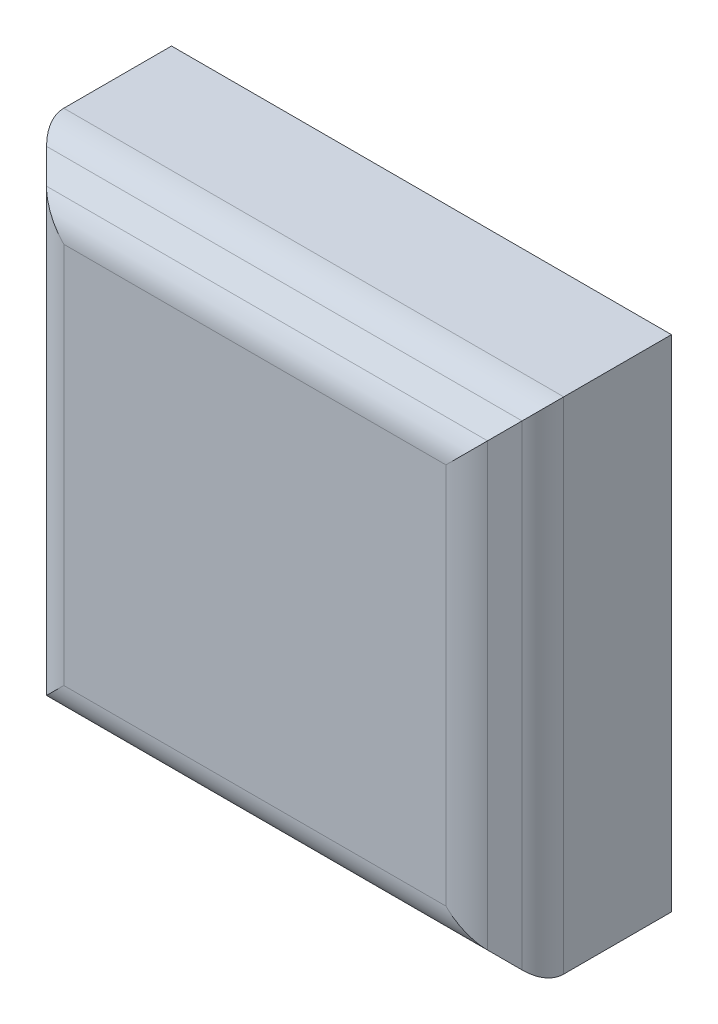
ISO-10303-21;
HEADER;
FILE_DESCRIPTION(('STEP AP214'),'2;1');
FILE_NAME('part.step','',(''),(''),'','','');
FILE_SCHEMA(('AUTOMOTIVE_DESIGN { 1 0 10303 214 1 1 1 1 }'));
ENDSEC;
DATA;
#1=APPLICATION_CONTEXT('core data for automotive mechanical design processes');
#2=APPLICATION_PROTOCOL_DEFINITION('international standard','automotive_design',2000,#1);
#3=PRODUCT_CONTEXT('',#1,'mechanical');
#4=PRODUCT('Part','Part','',(#3));
#5=PRODUCT_RELATED_PRODUCT_CATEGORY('part','',(#4));
#6=PRODUCT_DEFINITION_FORMATION('','',#4);
#7=PRODUCT_DEFINITION_CONTEXT('part definition',#1,'design');
#8=PRODUCT_DEFINITION('design','',#6,#7);
#9=PRODUCT_DEFINITION_SHAPE('','',#8);
#10=(LENGTH_UNIT() NAMED_UNIT(*) SI_UNIT(.MILLI.,.METRE.));
#11=(NAMED_UNIT(*) PLANE_ANGLE_UNIT() SI_UNIT($,.RADIAN.));
#12=(NAMED_UNIT(*) SI_UNIT($,.STERADIAN.) SOLID_ANGLE_UNIT());
#13=UNCERTAINTY_MEASURE_WITH_UNIT(LENGTH_MEASURE(1.E-05),#10,'distance_accuracy_value','');
#14=(GEOMETRIC_REPRESENTATION_CONTEXT(3) GLOBAL_UNCERTAINTY_ASSIGNED_CONTEXT((#13)) GLOBAL_UNIT_ASSIGNED_CONTEXT((#10,
#11,#12)) REPRESENTATION_CONTEXT('',''));
#15=CARTESIAN_POINT('',(0.,0.,0.));
#16=DIRECTION('',(0.,0.,1.));
#17=DIRECTION('',(1.,0.,0.));
#18=AXIS2_PLACEMENT_3D('',#15,#16,#17);
#19=CARTESIAN_POINT('',(-36.4889051706092,115.943688507431,40.));
#20=DIRECTION('',(1.,0.,0.));
#21=DIRECTION('',(0.,1.,0.));
#22=AXIS2_PLACEMENT_3D('',#19,#20,#21);
#23=PLANE('',#22);
#24=DIRECTION('',(0.,0.,-1.));
#25=VECTOR('',#24,1.);
#26=CARTESIAN_POINT('',(-36.4889051706092,-4.05631149256856,40.));
#27=LINE('',#26,#25);
#28=CARTESIAN_POINT('',(-36.4889051706092,-4.05631149256856,25.857864376269));
#29=VERTEX_POINT('',#28);
#30=CARTESIAN_POINT('',(-36.4889051706092,-4.05631149256856,0.));
#31=VERTEX_POINT('',#30);
#32=EDGE_CURVE('E219',#29,#31,#27,.T.);
#33=ORIENTED_EDGE('',*,*,#32,.F.);
#34=DIRECTION('',(0.,1.,0.));
#35=VECTOR('',#34,1.);
#36=CARTESIAN_POINT('',(-36.4889051706092,115.943688507431,25.857864376269));
#37=LINE('',#36,#35);
#38=CARTESIAN_POINT('',(-36.4889051706092,115.943688507431,25.857864376269));
#39=VERTEX_POINT('',#38);
#40=EDGE_CURVE('E60',#29,#39,#37,.T.);
#41=ORIENTED_EDGE('',*,*,#40,.T.);
#42=DIRECTION('',(0.,0.,-1.));
#43=VECTOR('',#42,1.);
#44=CARTESIAN_POINT('',(-36.4889051706092,115.943688507431,40.));
#45=LINE('',#44,#43);
#46=CARTESIAN_POINT('',(-36.4889051706092,115.943688507431,0.));
#47=VERTEX_POINT('',#46);
#48=EDGE_CURVE('E213',#39,#47,#45,.T.);
#49=ORIENTED_EDGE('',*,*,#48,.T.);
#50=DIRECTION('',(0.,-1.,0.));
#51=VECTOR('',#50,1.);
#52=CARTESIAN_POINT('',(-36.4889051706092,115.943688507431,0.));
#53=LINE('',#52,#51);
#54=EDGE_CURVE('E200',#47,#31,#53,.T.);
#55=ORIENTED_EDGE('',*,*,#54,.T.);
#56=EDGE_LOOP('',(#33,#41,#49,#55));
#57=FACE_BOUND('',#56,.T.);
#58=ADVANCED_FACE('F35',(#57),#23,.F.);
#59=CARTESIAN_POINT('',(-36.4889051706092,-4.05631149256856,40.));
#60=DIRECTION('',(0.,1.,0.));
#61=DIRECTION('',(0.,0.,1.));
#62=AXIS2_PLACEMENT_3D('',#59,#60,#61);
#63=PLANE('',#62);
#64=DIRECTION('',(0.,0.,-1.));
#65=VECTOR('',#64,1.);
#66=CARTESIAN_POINT('',(83.5110948293908,-4.05631149256856,40.));
#67=LINE('',#66,#65);
#68=CARTESIAN_POINT('',(83.5110948293908,-4.05631149256856,25.857864376269));
#69=VERTEX_POINT('',#68);
#70=CARTESIAN_POINT('',(83.5110948293908,-4.05631149256856,0.));
#71=VERTEX_POINT('',#70);
#72=EDGE_CURVE('E217',#69,#71,#67,.T.);
#73=ORIENTED_EDGE('',*,*,#72,.F.);
#74=DIRECTION('',(-1.,0.,0.));
#75=VECTOR('',#74,1.);
#76=CARTESIAN_POINT('',(-36.4889051706092,-4.05631149256856,25.857864376269));
#77=LINE('',#76,#75);
#78=EDGE_CURVE('E259',#69,#29,#77,.T.);
#79=ORIENTED_EDGE('',*,*,#78,.T.);
#80=ORIENTED_EDGE('',*,*,#32,.T.);
#81=DIRECTION('',(1.,0.,0.));
#82=VECTOR('',#81,1.);
#83=CARTESIAN_POINT('',(-36.4889051706092,-4.05631149256856,0.));
#84=LINE('',#83,#82);
#85=EDGE_CURVE('E203',#31,#71,#84,.T.);
#86=ORIENTED_EDGE('',*,*,#85,.T.);
#87=EDGE_LOOP('',(#73,#79,#80,#86));
#88=FACE_BOUND('',#87,.T.);
#89=ADVANCED_FACE('F339',(#88),#63,.F.);
#90=CARTESIAN_POINT('',(83.5110948293908,115.943688507431,40.));
#91=DIRECTION('',(-1.,0.,0.));
#92=DIRECTION('',(0.,-1.,0.));
#93=AXIS2_PLACEMENT_3D('',#90,#91,#92);
#94=PLANE('',#93);
#95=DIRECTION('',(0.,0.,-1.));
#96=VECTOR('',#95,1.);
#97=CARTESIAN_POINT('',(83.5110948293908,115.943688507431,40.));
#98=LINE('',#97,#96);
#99=CARTESIAN_POINT('',(83.5110948293908,115.943688507431,25.857864376269));
#100=VERTEX_POINT('',#99);
#101=CARTESIAN_POINT('',(83.5110948293908,115.943688507431,0.));
#102=VERTEX_POINT('',#101);
#103=EDGE_CURVE('E215',#100,#102,#98,.T.);
#104=ORIENTED_EDGE('',*,*,#103,.F.);
#105=DIRECTION('',(0.,-1.,0.));
#106=VECTOR('',#105,1.);
#107=CARTESIAN_POINT('',(83.5110948293908,-4.05631149256856,25.857864376269));
#108=LINE('',#107,#106);
#109=EDGE_CURVE('E221',#100,#69,#108,.T.);
#110=ORIENTED_EDGE('',*,*,#109,.T.);
#111=ORIENTED_EDGE('',*,*,#72,.T.);
#112=DIRECTION('',(0.,1.,0.));
#113=VECTOR('',#112,1.);
#114=CARTESIAN_POINT('',(83.5110948293908,115.943688507431,0.));
#115=LINE('',#114,#113);
#116=EDGE_CURVE('E207',#71,#102,#115,.T.);
#117=ORIENTED_EDGE('',*,*,#116,.T.);
#118=EDGE_LOOP('',(#104,#110,#111,#117));
#119=FACE_BOUND('',#118,.T.);
#120=ADVANCED_FACE('F330',(#119),#94,.F.);
#121=CARTESIAN_POINT('',(-36.4889051706092,115.943688507431,40.));
#122=DIRECTION('',(0.,-1.,0.));
#123=DIRECTION('',(0.,0.,-1.));
#124=AXIS2_PLACEMENT_3D('',#121,#122,#123);
#125=PLANE('',#124);
#126=ORIENTED_EDGE('',*,*,#48,.F.);
#127=DIRECTION('',(1.,0.,0.));
#128=VECTOR('',#127,1.);
#129=CARTESIAN_POINT('',(83.5110948293908,115.943688507431,25.857864376269));
#130=LINE('',#129,#128);
#131=EDGE_CURVE('E262',#39,#100,#130,.T.);
#132=ORIENTED_EDGE('',*,*,#131,.T.);
#133=ORIENTED_EDGE('',*,*,#103,.T.);
#134=DIRECTION('',(-1.,0.,0.));
#135=VECTOR('',#134,1.);
#136=CARTESIAN_POINT('',(-36.4889051706092,115.943688507431,0.));
#137=LINE('',#136,#135);
#138=EDGE_CURVE('E210',#102,#47,#137,.T.);
#139=ORIENTED_EDGE('',*,*,#138,.T.);
#140=EDGE_LOOP('',(#126,#132,#133,#139));
#141=FACE_BOUND('',#140,.T.);
#142=ADVANCED_FACE('F328',(#141),#125,.F.);
#143=CARTESIAN_POINT('',(0.,0.,40.));
#144=DIRECTION('',(0.,0.,1.));
#145=DIRECTION('',(1.,0.,0.));
#146=AXIS2_PLACEMENT_3D('',#143,#144,#145);
#147=PLANE('',#146);
#148=DIRECTION('',(0.,-1.,0.));
#149=VECTOR('',#148,1.);
#150=CARTESIAN_POINT('',(-22.3467695468782,0.,40.));
#151=LINE('',#150,#149);
#152=CARTESIAN_POINT('',(-22.3467695468782,101.8015528837,40.));
#153=VERTEX_POINT('',#152);
#154=CARTESIAN_POINT('',(-22.3467695468782,10.0858241311624,40.));
#155=VERTEX_POINT('',#154);
#156=EDGE_CURVE('E245',#153,#155,#151,.T.);
#157=ORIENTED_EDGE('',*,*,#156,.T.);
#158=DIRECTION('',(1.,0.,0.));
#159=VECTOR('',#158,1.);
#160=CARTESIAN_POINT('',(0.,10.0858241311624,40.));
#161=LINE('',#160,#159);
#162=CARTESIAN_POINT('',(69.3689592056599,10.0858241311624,40.));
#163=VERTEX_POINT('',#162);
#164=EDGE_CURVE('E248',#155,#163,#161,.T.);
#165=ORIENTED_EDGE('',*,*,#164,.T.);
#166=DIRECTION('',(0.,1.,0.));
#167=VECTOR('',#166,1.);
#168=CARTESIAN_POINT('',(69.3689592056599,0.,40.));
#169=LINE('',#168,#167);
#170=CARTESIAN_POINT('',(69.3689592056599,101.8015528837,40.));
#171=VERTEX_POINT('',#170);
#172=EDGE_CURVE('E243',#163,#171,#169,.T.);
#173=ORIENTED_EDGE('',*,*,#172,.T.);
#174=DIRECTION('',(-1.,0.,0.));
#175=VECTOR('',#174,1.);
#176=CARTESIAN_POINT('',(0.,101.8015528837,40.));
#177=LINE('',#176,#175);
#178=EDGE_CURVE('E241',#171,#153,#177,.T.);
#179=ORIENTED_EDGE('',*,*,#178,.T.);
#180=EDGE_LOOP('',(#157,#165,#173,#179));
#181=FACE_BOUND('',#180,.T.);
#182=ADVANCED_FACE('F417',(#181),#147,.T.);
#183=CARTESIAN_POINT('',(0.,0.,0.));
#184=DIRECTION('',(0.,0.,1.));
#185=DIRECTION('',(1.,0.,0.));
#186=AXIS2_PLACEMENT_3D('',#183,#184,#185);
#187=PLANE('',#186);
#188=DIRECTION('',(-1.,0.,0.));
#189=VECTOR('',#188,1.);
#190=CARTESIAN_POINT('',(-36.4889051706092,105.943688507431,0.));
#191=LINE('',#190,#189);
#192=CARTESIAN_POINT('',(73.5110948293908,105.943688507431,0.));
#193=VERTEX_POINT('',#192);
#194=CARTESIAN_POINT('',(-26.4889051706092,105.943688507431,0.));
#195=VERTEX_POINT('',#194);
#196=EDGE_CURVE('E195',#193,#195,#191,.T.);
#197=ORIENTED_EDGE('',*,*,#196,.T.);
#198=DIRECTION('',(0.,-1.,0.));
#199=VECTOR('',#198,1.);
#200=CARTESIAN_POINT('',(-26.4889051706092,115.943688507431,0.));
#201=LINE('',#200,#199);
#202=CARTESIAN_POINT('',(-26.4889051706092,5.94368850743144,0.));
#203=VERTEX_POINT('',#202);
#204=EDGE_CURVE('E193',#195,#203,#201,.T.);
#205=ORIENTED_EDGE('',*,*,#204,.T.);
#206=DIRECTION('',(1.,0.,0.));
#207=VECTOR('',#206,1.);
#208=CARTESIAN_POINT('',(-36.4889051706092,5.94368850743144,0.));
#209=LINE('',#208,#207);
#210=CARTESIAN_POINT('',(73.5110948293908,5.94368850743144,0.));
#211=VERTEX_POINT('',#210);
#212=EDGE_CURVE('E156',#203,#211,#209,.T.);
#213=ORIENTED_EDGE('',*,*,#212,.T.);
#214=DIRECTION('',(0.,1.,0.));
#215=VECTOR('',#214,1.);
#216=CARTESIAN_POINT('',(73.5110948293908,115.943688507431,0.));
#217=LINE('',#216,#215);
#218=EDGE_CURVE('E52',#211,#193,#217,.T.);
#219=ORIENTED_EDGE('',*,*,#218,.T.);
#220=EDGE_LOOP('',(#197,#205,#213,#219));
#221=FACE_BOUND('',#220,.T.);
#222=ORIENTED_EDGE('',*,*,#54,.F.);
#223=ORIENTED_EDGE('',*,*,#138,.F.);
#224=ORIENTED_EDGE('',*,*,#116,.F.);
#225=ORIENTED_EDGE('',*,*,#85,.F.);
#226=EDGE_LOOP('',(#222,#223,#224,#225));
#227=FACE_BOUND('',#226,.T.);
#228=ADVANCED_FACE('F337',(#221,#227),#187,.F.);
#229=CARTESIAN_POINT('',(0.,105.943688507431,40.));
#230=DIRECTION('',(0.,0.707106781186548,0.707106781186547));
#231=DIRECTION('',(1.,0.,0.));
#232=AXIS2_PLACEMENT_3D('',#229,#230,#231);
#233=PLANE('',#232);
#234=DIRECTION('',(0.577350269189626,0.577350269189626,-0.577350269189626));
#235=VECTOR('',#234,1.);
#236=CARTESIAN_POINT('',(49.0073965529272,81.4399902309678,64.5036982764636));
#237=LINE('',#236,#235);
#238=CARTESIAN_POINT('',(80.5821626412563,113.014756319297,32.9289321881345));
#239=VERTEX_POINT('',#238);
#240=CARTESIAN_POINT('',(76.4400270175253,108.872620695566,37.0710678118655));
#241=VERTEX_POINT('',#240);
#242=EDGE_CURVE('E229',#239,#241,#237,.F.);
#243=ORIENTED_EDGE('',*,*,#242,.F.);
#244=DIRECTION('',(1.,0.,0.));
#245=VECTOR('',#244,1.);
#246=CARTESIAN_POINT('',(-36.4889051706092,113.014756319297,32.9289321881345));
#247=LINE('',#246,#245);
#248=CARTESIAN_POINT('',(-33.5599729824746,113.014756319297,32.9289321881345));
#249=VERTEX_POINT('',#248);
#250=EDGE_CURVE('E11',#239,#249,#247,.F.);
#251=ORIENTED_EDGE('',*,*,#250,.T.);
#252=DIRECTION('',(-0.577350269189626,0.577350269189626,-0.577350269189626));
#253=VECTOR('',#252,1.);
#254=CARTESIAN_POINT('',(8.8256576652013,70.629125671621,75.3145628358105));
#255=LINE('',#254,#253);
#256=CARTESIAN_POINT('',(-29.4178373587437,108.872620695566,37.0710678118655));
#257=VERTEX_POINT('',#256);
#258=EDGE_CURVE('E204',#257,#249,#255,.T.);
#259=ORIENTED_EDGE('',*,*,#258,.F.);
#260=DIRECTION('',(-1.,0.,0.));
#261=VECTOR('',#260,1.);
#262=CARTESIAN_POINT('',(0.,108.872620695566,37.0710678118655));
#263=LINE('',#262,#261);
#264=EDGE_CURVE('E44',#257,#241,#263,.F.);
#265=ORIENTED_EDGE('',*,*,#264,.T.);
#266=EDGE_LOOP('',(#243,#251,#259,#265));
#267=FACE_BOUND('',#266,.T.);
#268=ADVANCED_FACE('F314',(#267),#233,.T.);
#269=CARTESIAN_POINT('',(-26.4889051706091,0.,40.));
#270=DIRECTION('',(-0.707106781186548,0.,0.707106781186547));
#271=DIRECTION('',(0.,1.,0.));
#272=AXIS2_PLACEMENT_3D('',#269,#270,#271);
#273=PLANE('',#272);
#274=DIRECTION('',(0.577350269189626,0.577350269189626,0.577350269189626));
#275=VECTOR('',#274,1.);
#276=CARTESIAN_POINT('',(-28.4701346730863,3.96245900495431,38.0187704975228));
#277=LINE('',#276,#275);
#278=CARTESIAN_POINT('',(-29.4178373587437,3.01475631929694,37.0710678118655));
#279=VERTEX_POINT('',#278);
#280=CARTESIAN_POINT('',(-33.5599729824746,-1.12737930443405,32.9289321881345));
#281=VERTEX_POINT('',#280);
#282=EDGE_CURVE('E225',#279,#281,#277,.F.);
#283=ORIENTED_EDGE('',*,*,#282,.F.);
#284=DIRECTION('',(0.,-1.,0.));
#285=VECTOR('',#284,1.);
#286=CARTESIAN_POINT('',(-29.4178373587437,0.,37.0710678118655));
#287=LINE('',#286,#285);
#288=EDGE_CURVE('E252',#279,#257,#287,.F.);
#289=ORIENTED_EDGE('',*,*,#288,.T.);
#290=ORIENTED_EDGE('',*,*,#258,.T.);
#291=DIRECTION('',(0.,1.,0.));
#292=VECTOR('',#291,1.);
#293=CARTESIAN_POINT('',(-33.5599729824746,-4.05631149256856,32.9289321881345));
#294=LINE('',#293,#292);
#295=EDGE_CURVE('E250',#249,#281,#294,.F.);
#296=ORIENTED_EDGE('',*,*,#295,.T.);
#297=EDGE_LOOP('',(#283,#289,#290,#296));
#298=FACE_BOUND('',#297,.T.);
#299=ADVANCED_FACE('F318',(#298),#273,.T.);
#300=CARTESIAN_POINT('',(73.5110948293908,0.,40.));
#301=DIRECTION('',(0.707106781186548,0.,0.707106781186547));
#302=DIRECTION('',(0.,-1.,0.));
#303=AXIS2_PLACEMENT_3D('',#300,#301,#302);
#304=PLANE('',#303);
#305=DIRECTION('',(0.577350269189626,-0.577350269189625,-0.577350269189626));
#306=VECTOR('',#305,1.);
#307=CARTESIAN_POINT('',(75.492324331868,3.96245900495431,38.0187704975229));
#308=LINE('',#307,#306);
#309=CARTESIAN_POINT('',(80.5821626412563,-1.12737930443404,32.9289321881345));
#310=VERTEX_POINT('',#309);
#311=CARTESIAN_POINT('',(76.4400270175253,3.01475631929694,37.0710678118655));
#312=VERTEX_POINT('',#311);
#313=EDGE_CURVE('E222',#310,#312,#308,.F.);
#314=ORIENTED_EDGE('',*,*,#313,.F.);
#315=DIRECTION('',(0.,-1.,0.));
#316=VECTOR('',#315,1.);
#317=CARTESIAN_POINT('',(80.5821626412563,115.943688507431,32.9289321881345));
#318=LINE('',#317,#316);
#319=EDGE_CURVE('E238',#310,#239,#318,.F.);
#320=ORIENTED_EDGE('',*,*,#319,.T.);
#321=ORIENTED_EDGE('',*,*,#242,.T.);
#322=DIRECTION('',(0.,1.,0.));
#323=VECTOR('',#322,1.);
#324=CARTESIAN_POINT('',(76.4400270175254,0.,37.0710678118655));
#325=LINE('',#324,#323);
#326=EDGE_CURVE('E236',#241,#312,#325,.F.);
#327=ORIENTED_EDGE('',*,*,#326,.T.);
#328=EDGE_LOOP('',(#314,#320,#321,#327));
#329=FACE_BOUND('',#328,.T.);
#330=ADVANCED_FACE('F296',(#329),#304,.T.);
#331=CARTESIAN_POINT('',(0.,5.94368850743146,40.));
#332=DIRECTION('',(0.,-0.707106781186548,0.707106781186547));
#333=DIRECTION('',(-1.,0.,0.));
#334=AXIS2_PLACEMENT_3D('',#331,#332,#333);
#335=PLANE('',#334);
#336=ORIENTED_EDGE('',*,*,#313,.T.);
#337=DIRECTION('',(1.,0.,0.));
#338=VECTOR('',#337,1.);
#339=CARTESIAN_POINT('',(0.,3.01475631929693,37.0710678118655));
#340=LINE('',#339,#338);
#341=EDGE_CURVE('E257',#312,#279,#340,.F.);
#342=ORIENTED_EDGE('',*,*,#341,.T.);
#343=ORIENTED_EDGE('',*,*,#282,.T.);
#344=DIRECTION('',(-1.,0.,0.));
#345=VECTOR('',#344,1.);
#346=CARTESIAN_POINT('',(83.5110948293908,-1.12737930443404,32.9289321881345));
#347=LINE('',#346,#345);
#348=EDGE_CURVE('E255',#281,#310,#347,.F.);
#349=ORIENTED_EDGE('',*,*,#348,.T.);
#350=EDGE_LOOP('',(#336,#342,#343,#349));
#351=FACE_BOUND('',#350,.T.);
#352=ADVANCED_FACE('F300',(#351),#335,.T.);
#353=CARTESIAN_POINT('',(-26.4889051706092,115.943688507431,25.857864376269));
#354=DIRECTION('',(0.,-1.,0.));
#355=DIRECTION('',(1.,0.,0.));
#356=AXIS2_PLACEMENT_3D('',#353,#354,#355);
#357=CYLINDRICAL_SURFACE('',#356,10.);
#358=CARTESIAN_POINT('',(-26.4889051706092,5.94368850743144,25.857864376269));
#359=DIRECTION('',(0.707106781186547,-0.707106781186547,0.));
#360=DIRECTION('',(-0.707106781186547,-0.707106781186548,0.));
#361=AXIS2_PLACEMENT_3D('',#358,#359,#360);
#362=ELLIPSE('',#361,14.1421356237309,10.);
#363=EDGE_CURVE('E269',#281,#29,#362,.T.);
#364=ORIENTED_EDGE('',*,*,#363,.F.);
#365=ORIENTED_EDGE('',*,*,#295,.F.);
#366=CARTESIAN_POINT('',(-26.4889051706092,105.943688507431,25.857864376269));
#367=DIRECTION('',(-0.707106781186547,-0.707106781186548,0.));
#368=DIRECTION('',(-0.707106781186547,0.707106781186547,0.));
#369=AXIS2_PLACEMENT_3D('',#366,#367,#368);
#370=ELLIPSE('',#369,14.142135623731,10.);
#371=EDGE_CURVE('E226',#39,#249,#370,.F.);
#372=ORIENTED_EDGE('',*,*,#371,.F.);
#373=ORIENTED_EDGE('',*,*,#40,.F.);
#374=EDGE_LOOP('',(#364,#365,#372,#373));
#375=FACE_BOUND('',#374,.T.);
#376=ADVANCED_FACE('F322',(#375),#357,.T.);
#377=CARTESIAN_POINT('',(-36.4889051706092,105.943688507431,25.857864376269));
#378=DIRECTION('',(-1.,0.,0.));
#379=DIRECTION('',(0.,0.,1.));
#380=AXIS2_PLACEMENT_3D('',#377,#378,#379);
#381=CYLINDRICAL_SURFACE('',#380,10.);
#382=ORIENTED_EDGE('',*,*,#371,.T.);
#383=ORIENTED_EDGE('',*,*,#250,.F.);
#384=CARTESIAN_POINT('',(73.5110948293908,105.943688507431,25.857864376269));
#385=DIRECTION('',(-0.707106781186548,0.707106781186547,0.));
#386=DIRECTION('',(-0.707106781186547,-0.707106781186548,0.));
#387=AXIS2_PLACEMENT_3D('',#384,#385,#386);
#388=ELLIPSE('',#387,14.1421356237309,10.);
#389=EDGE_CURVE('E267',#100,#239,#388,.F.);
#390=ORIENTED_EDGE('',*,*,#389,.F.);
#391=ORIENTED_EDGE('',*,*,#131,.F.);
#392=EDGE_LOOP('',(#382,#383,#390,#391));
#393=FACE_BOUND('',#392,.T.);
#394=ADVANCED_FACE('F325',(#393),#381,.T.);
#395=CARTESIAN_POINT('',(-36.4889051706092,5.94368850743144,25.857864376269));
#396=DIRECTION('',(1.,0.,0.));
#397=DIRECTION('',(0.,0.,-1.));
#398=AXIS2_PLACEMENT_3D('',#395,#396,#397);
#399=CYLINDRICAL_SURFACE('',#398,10.);
#400=ORIENTED_EDGE('',*,*,#363,.T.);
#401=ORIENTED_EDGE('',*,*,#78,.F.);
#402=CARTESIAN_POINT('',(73.5110948293908,5.94368850743144,25.857864376269));
#403=DIRECTION('',(0.707106781186547,0.707106781186548,0.));
#404=DIRECTION('',(0.707106781186548,-0.707106781186547,0.));
#405=AXIS2_PLACEMENT_3D('',#402,#403,#404);
#406=ELLIPSE('',#405,14.142135623731,10.);
#407=EDGE_CURVE('E265',#310,#69,#406,.T.);
#408=ORIENTED_EDGE('',*,*,#407,.F.);
#409=ORIENTED_EDGE('',*,*,#348,.F.);
#410=EDGE_LOOP('',(#400,#401,#408,#409));
#411=FACE_BOUND('',#410,.T.);
#412=ADVANCED_FACE('F306',(#411),#399,.T.);
#413=CARTESIAN_POINT('',(73.5110948293908,115.943688507431,25.857864376269));
#414=DIRECTION('',(0.,1.,0.));
#415=DIRECTION('',(-1.,0.,0.));
#416=AXIS2_PLACEMENT_3D('',#413,#414,#415);
#417=CYLINDRICAL_SURFACE('',#416,10.);
#418=ORIENTED_EDGE('',*,*,#389,.T.);
#419=ORIENTED_EDGE('',*,*,#319,.F.);
#420=ORIENTED_EDGE('',*,*,#407,.T.);
#421=ORIENTED_EDGE('',*,*,#109,.F.);
#422=EDGE_LOOP('',(#418,#419,#420,#421));
#423=FACE_BOUND('',#422,.T.);
#424=ADVANCED_FACE('F310',(#423),#417,.T.);
#425=CARTESIAN_POINT('',(69.3689592056599,0.,30.));
#426=DIRECTION('',(0.,1.,0.));
#427=DIRECTION('',(-1.,0.,0.));
#428=AXIS2_PLACEMENT_3D('',#425,#426,#427);
#429=CYLINDRICAL_SURFACE('',#428,10.);
#430=CARTESIAN_POINT('',(69.3689592056599,10.0858241311624,30.));
#431=DIRECTION('',(0.707106781186547,0.707106781186548,0.));
#432=DIRECTION('',(0.707106781186548,-0.707106781186547,0.));
#433=AXIS2_PLACEMENT_3D('',#430,#431,#432);
#434=ELLIPSE('',#433,14.142135623731,10.);
#435=EDGE_CURVE('E278',#312,#163,#434,.F.);
#436=ORIENTED_EDGE('',*,*,#435,.F.);
#437=ORIENTED_EDGE('',*,*,#326,.F.);
#438=CARTESIAN_POINT('',(69.3689592056599,101.8015528837,30.));
#439=DIRECTION('',(-0.707106781186548,0.707106781186547,0.));
#440=DIRECTION('',(-0.707106781186547,-0.707106781186548,0.));
#441=AXIS2_PLACEMENT_3D('',#438,#439,#440);
#442=ELLIPSE('',#441,14.1421356237309,10.);
#443=EDGE_CURVE('E39',#171,#241,#442,.T.);
#444=ORIENTED_EDGE('',*,*,#443,.F.);
#445=ORIENTED_EDGE('',*,*,#172,.F.);
#446=EDGE_LOOP('',(#436,#437,#444,#445));
#447=FACE_BOUND('',#446,.T.);
#448=ADVANCED_FACE('F37',(#447),#429,.T.);
#449=CARTESIAN_POINT('',(0.,101.8015528837,30.));
#450=DIRECTION('',(-1.,0.,0.));
#451=DIRECTION('',(0.,0.,1.));
#452=AXIS2_PLACEMENT_3D('',#449,#450,#451);
#453=CYLINDRICAL_SURFACE('',#452,10.);
#454=ORIENTED_EDGE('',*,*,#443,.T.);
#455=ORIENTED_EDGE('',*,*,#264,.F.);
#456=CARTESIAN_POINT('',(-22.3467695468782,101.8015528837,30.));
#457=DIRECTION('',(-0.707106781186547,-0.707106781186548,0.));
#458=DIRECTION('',(-0.707106781186547,0.707106781186547,0.));
#459=AXIS2_PLACEMENT_3D('',#456,#457,#458);
#460=ELLIPSE('',#459,14.142135623731,10.);
#461=EDGE_CURVE('E276',#153,#257,#460,.T.);
#462=ORIENTED_EDGE('',*,*,#461,.F.);
#463=ORIENTED_EDGE('',*,*,#178,.F.);
#464=EDGE_LOOP('',(#454,#455,#462,#463));
#465=FACE_BOUND('',#464,.T.);
#466=ADVANCED_FACE('F289',(#465),#453,.T.);
#467=CARTESIAN_POINT('',(0.,10.0858241311624,30.));
#468=DIRECTION('',(1.,0.,0.));
#469=DIRECTION('',(0.,0.,-1.));
#470=AXIS2_PLACEMENT_3D('',#467,#468,#469);
#471=CYLINDRICAL_SURFACE('',#470,10.);
#472=ORIENTED_EDGE('',*,*,#435,.T.);
#473=ORIENTED_EDGE('',*,*,#164,.F.);
#474=CARTESIAN_POINT('',(-22.3467695468782,10.0858241311624,30.));
#475=DIRECTION('',(0.707106781186547,-0.707106781186547,0.));
#476=DIRECTION('',(0.707106781186547,0.707106781186548,0.));
#477=AXIS2_PLACEMENT_3D('',#474,#475,#476);
#478=ELLIPSE('',#477,14.1421356237309,10.);
#479=EDGE_CURVE('E274',#279,#155,#478,.F.);
#480=ORIENTED_EDGE('',*,*,#479,.F.);
#481=ORIENTED_EDGE('',*,*,#341,.F.);
#482=EDGE_LOOP('',(#472,#473,#480,#481));
#483=FACE_BOUND('',#482,.T.);
#484=ADVANCED_FACE('F369',(#483),#471,.T.);
#485=CARTESIAN_POINT('',(-22.3467695468782,0.,30.));
#486=DIRECTION('',(0.,-1.,0.));
#487=DIRECTION('',(1.,0.,0.));
#488=AXIS2_PLACEMENT_3D('',#485,#486,#487);
#489=CYLINDRICAL_SURFACE('',#488,10.);
#490=ORIENTED_EDGE('',*,*,#461,.T.);
#491=ORIENTED_EDGE('',*,*,#288,.F.);
#492=ORIENTED_EDGE('',*,*,#479,.T.);
#493=ORIENTED_EDGE('',*,*,#156,.F.);
#494=EDGE_LOOP('',(#490,#491,#492,#493));
#495=FACE_BOUND('',#494,.T.);
#496=ADVANCED_FACE('F366',(#495),#489,.T.);
#497=CARTESIAN_POINT('',(-26.4889051706092,115.943688507431,40.));
#498=DIRECTION('',(1.,0.,0.));
#499=DIRECTION('',(0.,1.,0.));
#500=AXIS2_PLACEMENT_3D('',#497,#498,#499);
#501=PLANE('',#500);
#502=DIRECTION('',(0.,0.,-1.));
#503=VECTOR('',#502,1.);
#504=CARTESIAN_POINT('',(-26.4889051706092,5.94368850743144,40.));
#505=LINE('',#504,#503);
#506=CARTESIAN_POINT('',(-26.4889051706092,5.94368850743144,25.857864376269));
#507=VERTEX_POINT('',#506);
#508=EDGE_CURVE('E150',#507,#203,#505,.T.);
#509=ORIENTED_EDGE('',*,*,#508,.T.);
#510=ORIENTED_EDGE('',*,*,#204,.F.);
#511=DIRECTION('',(0.,0.,-1.));
#512=VECTOR('',#511,1.);
#513=CARTESIAN_POINT('',(-26.4889051706092,105.943688507431,40.));
#514=LINE('',#513,#512);
#515=CARTESIAN_POINT('',(-26.4889051706092,105.943688507431,25.857864376269));
#516=VERTEX_POINT('',#515);
#517=EDGE_CURVE('E178',#516,#195,#514,.T.);
#518=ORIENTED_EDGE('',*,*,#517,.F.);
#519=DIRECTION('',(0.,-1.,0.));
#520=VECTOR('',#519,1.);
#521=CARTESIAN_POINT('',(-26.4889051706092,115.943688507431,25.857864376269));
#522=LINE('',#521,#520);
#523=EDGE_CURVE('E176',#516,#507,#522,.T.);
#524=ORIENTED_EDGE('',*,*,#523,.T.);
#525=EDGE_LOOP('',(#509,#510,#518,#524));
#526=FACE_BOUND('',#525,.T.);
#527=ADVANCED_FACE('F177',(#526),#501,.T.);
#528=CARTESIAN_POINT('',(-36.4889051706092,5.94368850743144,40.));
#529=DIRECTION('',(0.,1.,0.));
#530=DIRECTION('',(0.,0.,1.));
#531=AXIS2_PLACEMENT_3D('',#528,#529,#530);
#532=PLANE('',#531);
#533=DIRECTION('',(0.,0.,-1.));
#534=VECTOR('',#533,1.);
#535=CARTESIAN_POINT('',(73.5110948293908,5.94368850743143,40.));
#536=LINE('',#535,#534);
#537=CARTESIAN_POINT('',(73.5110948293908,5.94368850743144,25.857864376269));
#538=VERTEX_POINT('',#537);
#539=EDGE_CURVE('E162',#538,#211,#536,.T.);
#540=ORIENTED_EDGE('',*,*,#539,.T.);
#541=ORIENTED_EDGE('',*,*,#212,.F.);
#542=ORIENTED_EDGE('',*,*,#508,.F.);
#543=DIRECTION('',(-1.,0.,0.));
#544=VECTOR('',#543,1.);
#545=CARTESIAN_POINT('',(0.,5.94368850743144,25.857864376269));
#546=LINE('',#545,#544);
#547=EDGE_CURVE('E153',#538,#507,#546,.T.);
#548=ORIENTED_EDGE('',*,*,#547,.F.);
#549=EDGE_LOOP('',(#540,#541,#542,#548));
#550=FACE_BOUND('',#549,.T.);
#551=ADVANCED_FACE('F152',(#550),#532,.T.);
#552=CARTESIAN_POINT('',(73.5110948293908,115.943688507431,40.));
#553=DIRECTION('',(-1.,0.,0.));
#554=DIRECTION('',(0.,-1.,0.));
#555=AXIS2_PLACEMENT_3D('',#552,#553,#554);
#556=PLANE('',#555);
#557=DIRECTION('',(0.,0.,-1.));
#558=VECTOR('',#557,1.);
#559=CARTESIAN_POINT('',(73.5110948293908,105.943688507431,40.));
#560=LINE('',#559,#558);
#561=CARTESIAN_POINT('',(73.5110948293908,105.943688507431,25.857864376269));
#562=VERTEX_POINT('',#561);
#563=EDGE_CURVE('E578',#562,#193,#560,.T.);
#564=ORIENTED_EDGE('',*,*,#563,.T.);
#565=ORIENTED_EDGE('',*,*,#218,.F.);
#566=ORIENTED_EDGE('',*,*,#539,.F.);
#567=DIRECTION('',(0.,1.,0.));
#568=VECTOR('',#567,1.);
#569=CARTESIAN_POINT('',(73.5110948293908,115.943688507431,25.857864376269));
#570=LINE('',#569,#568);
#571=EDGE_CURVE('E573',#538,#562,#570,.T.);
#572=ORIENTED_EDGE('',*,*,#571,.T.);
#573=EDGE_LOOP('',(#564,#565,#566,#572));
#574=FACE_BOUND('',#573,.T.);
#575=ADVANCED_FACE('F499',(#574),#556,.T.);
#576=CARTESIAN_POINT('',(-36.4889051706092,105.943688507431,40.));
#577=DIRECTION('',(0.,-1.,0.));
#578=DIRECTION('',(0.,0.,-1.));
#579=AXIS2_PLACEMENT_3D('',#576,#577,#578);
#580=PLANE('',#579);
#581=ORIENTED_EDGE('',*,*,#517,.T.);
#582=ORIENTED_EDGE('',*,*,#196,.F.);
#583=ORIENTED_EDGE('',*,*,#563,.F.);
#584=DIRECTION('',(-1.,0.,0.));
#585=VECTOR('',#584,1.);
#586=CARTESIAN_POINT('',(-36.4889051706092,105.943688507431,25.857864376269));
#587=LINE('',#586,#585);
#588=EDGE_CURVE('E277',#562,#516,#587,.T.);
#589=ORIENTED_EDGE('',*,*,#588,.T.);
#590=EDGE_LOOP('',(#581,#582,#583,#589));
#591=FACE_BOUND('',#590,.T.);
#592=ADVANCED_FACE('F507',(#591),#580,.T.);
#593=CARTESIAN_POINT('',(0.,0.,30.));
#594=DIRECTION('',(0.,0.,1.));
#595=DIRECTION('',(1.,0.,0.));
#596=AXIS2_PLACEMENT_3D('',#593,#594,#595);
#597=PLANE('',#596);
#598=DIRECTION('',(0.,1.,0.));
#599=VECTOR('',#598,1.);
#600=CARTESIAN_POINT('',(-22.3467695468782,0.,30.));
#601=LINE('',#600,#599);
#602=CARTESIAN_POINT('',(-22.3467695468782,10.0858241311624,30.));
#603=VERTEX_POINT('',#602);
#604=CARTESIAN_POINT('',(-22.3467695468782,101.8015528837,30.));
#605=VERTEX_POINT('',#604);
#606=EDGE_CURVE('E172',#603,#605,#601,.T.);
#607=ORIENTED_EDGE('',*,*,#606,.T.);
#608=DIRECTION('',(1.,0.,0.));
#609=VECTOR('',#608,1.);
#610=CARTESIAN_POINT('',(0.,101.8015528837,30.));
#611=LINE('',#610,#609);
#612=CARTESIAN_POINT('',(69.3689592056599,101.8015528837,30.));
#613=VERTEX_POINT('',#612);
#614=EDGE_CURVE('E171',#605,#613,#611,.T.);
#615=ORIENTED_EDGE('',*,*,#614,.T.);
#616=DIRECTION('',(0.,-1.,0.));
#617=VECTOR('',#616,1.);
#618=CARTESIAN_POINT('',(69.3689592056599,0.,30.));
#619=LINE('',#618,#617);
#620=CARTESIAN_POINT('',(69.3689592056599,10.0858241311624,30.));
#621=VERTEX_POINT('',#620);
#622=EDGE_CURVE('E161',#613,#621,#619,.T.);
#623=ORIENTED_EDGE('',*,*,#622,.T.);
#624=DIRECTION('',(1.,0.,0.));
#625=VECTOR('',#624,1.);
#626=CARTESIAN_POINT('',(0.,10.0858241311624,30.));
#627=LINE('',#626,#625);
#628=EDGE_CURVE('E180',#603,#621,#627,.T.);
#629=ORIENTED_EDGE('',*,*,#628,.F.);
#630=EDGE_LOOP('',(#607,#615,#623,#629));
#631=FACE_BOUND('',#630,.T.);
#632=ADVANCED_FACE('F515',(#631),#597,.F.);
#633=CARTESIAN_POINT('',(0.,98.8726206955659,32.9289321881345));
#634=DIRECTION('',(0.,0.707106781186548,0.707106781186547));
#635=DIRECTION('',(1.,0.,0.));
#636=AXIS2_PLACEMENT_3D('',#633,#634,#635);
#637=PLANE('',#636);
#638=DIRECTION('',(-0.577350269189626,-0.577350269189626,0.577350269189626));
#639=VECTOR('',#638,1.);
#640=CARTESIAN_POINT('',(33.4824867856701,65.9150804637107,65.8864724199898));
#641=LINE('',#640,#639);
#642=EDGE_CURVE('E185',#562,#613,#641,.T.);
#643=ORIENTED_EDGE('',*,*,#642,.T.);
#644=ORIENTED_EDGE('',*,*,#614,.F.);
#645=DIRECTION('',(-0.577350269189626,0.577350269189626,-0.577350269189626));
#646=VECTOR('',#645,1.);
#647=CARTESIAN_POINT('',(13.5397028731116,65.9150804637107,65.8864724199898));
#648=LINE('',#647,#646);
#649=EDGE_CURVE('E187',#605,#516,#648,.T.);
#650=ORIENTED_EDGE('',*,*,#649,.T.);
#651=ORIENTED_EDGE('',*,*,#588,.F.);
#652=EDGE_LOOP('',(#643,#644,#650,#651));
#653=FACE_BOUND('',#652,.T.);
#654=ADVANCED_FACE('F524',(#653),#637,.F.);
#655=CARTESIAN_POINT('',(-19.4178373587437,0.,32.9289321881345));
#656=DIRECTION('',(-0.707106781186548,0.,0.707106781186547));
#657=DIRECTION('',(0.,1.,0.));
#658=AXIS2_PLACEMENT_3D('',#655,#656,#657);
#659=PLANE('',#658);
#660=DIRECTION('',(-0.577350269189626,-0.577350269189626,-0.577350269189626));
#661=VECTOR('',#660,1.);
#662=CARTESIAN_POINT('',(-12.9452249058291,19.4873687722115,39.4015446410491));
#663=LINE('',#662,#661);
#664=EDGE_CURVE('E168',#603,#507,#663,.T.);
#665=ORIENTED_EDGE('',*,*,#664,.T.);
#666=ORIENTED_EDGE('',*,*,#523,.F.);
#667=ORIENTED_EDGE('',*,*,#649,.F.);
#668=ORIENTED_EDGE('',*,*,#606,.F.);
#669=EDGE_LOOP('',(#665,#666,#667,#668));
#670=FACE_BOUND('',#669,.T.);
#671=ADVANCED_FACE('F182',(#670),#659,.F.);
#672=CARTESIAN_POINT('',(66.4400270175253,0.,32.9289321881345));
#673=DIRECTION('',(0.707106781186548,0.,0.707106781186547));
#674=DIRECTION('',(0.,-1.,0.));
#675=AXIS2_PLACEMENT_3D('',#672,#673,#674);
#676=PLANE('',#675);
#677=DIRECTION('',(-0.577350269189626,0.577350269189625,0.577350269189626));
#678=VECTOR('',#677,1.);
#679=CARTESIAN_POINT('',(44.2933513450169,35.1614319918054,55.075607860643));
#680=LINE('',#679,#678);
#681=EDGE_CURVE('E170',#538,#621,#680,.T.);
#682=ORIENTED_EDGE('',*,*,#681,.T.);
#683=ORIENTED_EDGE('',*,*,#622,.F.);
#684=ORIENTED_EDGE('',*,*,#642,.F.);
#685=ORIENTED_EDGE('',*,*,#571,.F.);
#686=EDGE_LOOP('',(#682,#683,#684,#685));
#687=FACE_BOUND('',#686,.T.);
#688=ADVANCED_FACE('F541',(#687),#676,.F.);
#689=CARTESIAN_POINT('',(0.,13.0147563192969,32.9289321881345));
#690=DIRECTION('',(0.,-0.707106781186548,0.707106781186547));
#691=DIRECTION('',(-1.,0.,0.));
#692=AXIS2_PLACEMENT_3D('',#689,#690,#691);
#693=PLANE('',#692);
#694=ORIENTED_EDGE('',*,*,#681,.F.);
#695=ORIENTED_EDGE('',*,*,#547,.T.);
#696=ORIENTED_EDGE('',*,*,#664,.F.);
#697=ORIENTED_EDGE('',*,*,#628,.T.);
#698=EDGE_LOOP('',(#694,#695,#696,#697));
#699=FACE_BOUND('',#698,.T.);
#700=ADVANCED_FACE('F166',(#699),#693,.F.);
#701=CLOSED_SHELL('',(#58,#89,#120,#142,#182,#228,#268,#299,#330,#352,#376,#394,#412,#424,#448,
#466,#484,#496,#527,#551,#575,#592,#632,#654,#671,#688,#700));
#702=MANIFOLD_SOLID_BREP('B2',#701);
#703=ADVANCED_BREP_SHAPE_REPRESENTATION('',(#18,#702),#14);
#704=SHAPE_DEFINITION_REPRESENTATION(#9,#703);
ENDSEC;
END-ISO-10303-21;
